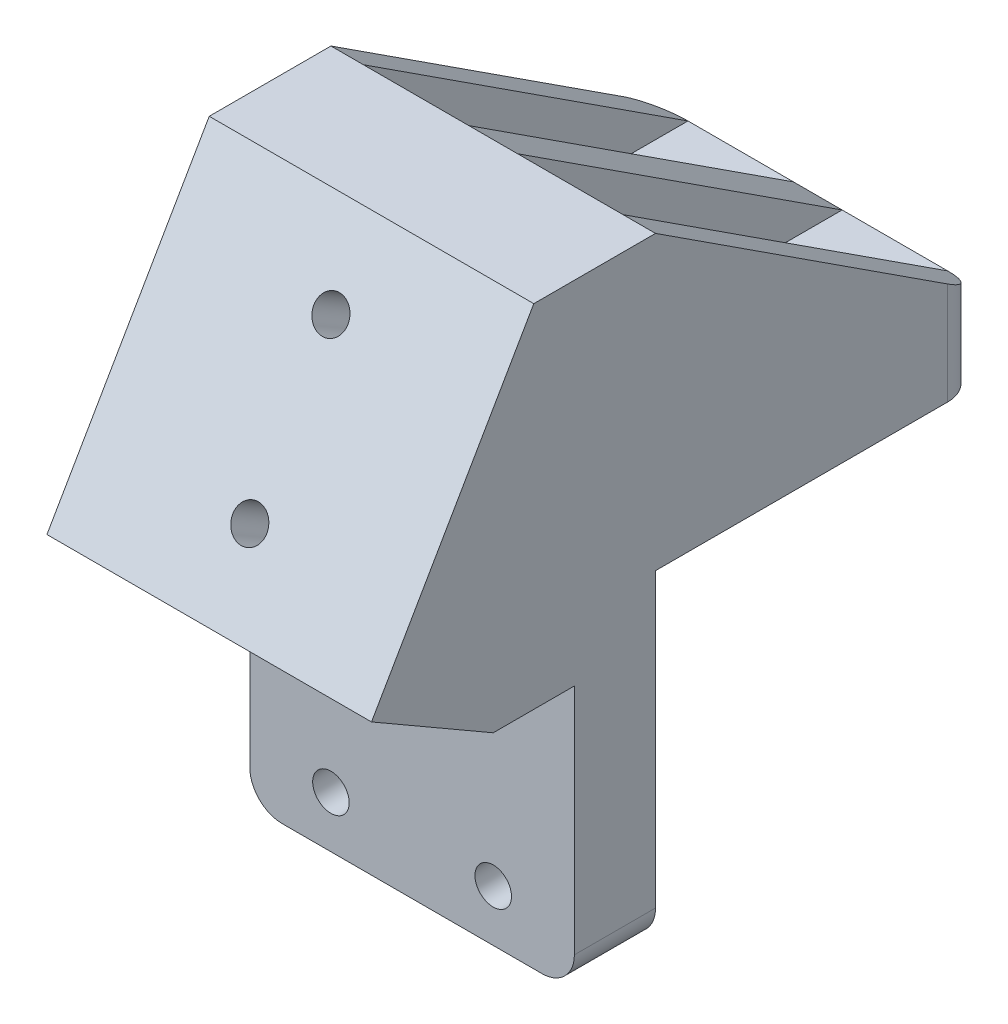
ISO-10303-21;
HEADER;
FILE_DESCRIPTION(('STEP AP214'),'2;1');
FILE_NAME('part.step','',(''),(''),'','','');
FILE_SCHEMA(('AUTOMOTIVE_DESIGN { 1 0 10303 214 1 1 1 1 }'));
ENDSEC;
DATA;
#1=APPLICATION_CONTEXT('core data for automotive mechanical design processes');
#2=APPLICATION_PROTOCOL_DEFINITION('international standard','automotive_design',2000,#1);
#3=PRODUCT_CONTEXT('',#1,'mechanical');
#4=PRODUCT('Part','Part','',(#3));
#5=PRODUCT_RELATED_PRODUCT_CATEGORY('part','',(#4));
#6=PRODUCT_DEFINITION_FORMATION('','',#4);
#7=PRODUCT_DEFINITION_CONTEXT('part definition',#1,'design');
#8=PRODUCT_DEFINITION('design','',#6,#7);
#9=PRODUCT_DEFINITION_SHAPE('','',#8);
#10=(LENGTH_UNIT() NAMED_UNIT(*) SI_UNIT(.MILLI.,.METRE.));
#11=(NAMED_UNIT(*) PLANE_ANGLE_UNIT() SI_UNIT($,.RADIAN.));
#12=(NAMED_UNIT(*) SI_UNIT($,.STERADIAN.) SOLID_ANGLE_UNIT());
#13=UNCERTAINTY_MEASURE_WITH_UNIT(LENGTH_MEASURE(1.E-05),#10,'distance_accuracy_value','');
#14=(GEOMETRIC_REPRESENTATION_CONTEXT(3) GLOBAL_UNCERTAINTY_ASSIGNED_CONTEXT((#13)) GLOBAL_UNIT_ASSIGNED_CONTEXT((#10,
#11,#12)) REPRESENTATION_CONTEXT('',''));
#15=CARTESIAN_POINT('',(0.,0.,0.));
#16=DIRECTION('',(0.,0.,1.));
#17=DIRECTION('',(1.,0.,0.));
#18=AXIS2_PLACEMENT_3D('',#15,#16,#17);
#19=CARTESIAN_POINT('',(40.,10.,-40.));
#20=DIRECTION('',(0.,-1.,0.));
#21=DIRECTION('',(0.,0.,-1.));
#22=AXIS2_PLACEMENT_3D('',#19,#20,#21);
#23=PLANE('',#22);
#24=CARTESIAN_POINT('',(30.,10.,-30.));
#25=DIRECTION('',(0.,-1.,0.));
#26=DIRECTION('',(0.,0.,-1.));
#27=AXIS2_PLACEMENT_3D('',#24,#25,#26);
#28=CIRCLE('',#27,2.25);
#29=CARTESIAN_POINT('',(30.,10.,-32.25));
#30=VERTEX_POINT('',#29);
#31=EDGE_CURVE('E214',#30,#30,#28,.T.);
#32=ORIENTED_EDGE('',*,*,#31,.T.);
#33=EDGE_LOOP('',(#32));
#34=FACE_BOUND('',#33,.T.);
#35=CARTESIAN_POINT('',(30.,10.,-10.));
#36=DIRECTION('',(0.,-1.,0.));
#37=DIRECTION('',(0.,0.,-1.));
#38=AXIS2_PLACEMENT_3D('',#35,#36,#37);
#39=CIRCLE('',#38,2.25);
#40=CARTESIAN_POINT('',(30.,10.,-12.25));
#41=VERTEX_POINT('',#40);
#42=EDGE_CURVE('E218',#41,#41,#39,.T.);
#43=ORIENTED_EDGE('',*,*,#42,.T.);
#44=EDGE_LOOP('',(#43));
#45=FACE_BOUND('',#44,.T.);
#46=DIRECTION('',(0.,0.,-1.));
#47=VECTOR('',#46,1.);
#48=CARTESIAN_POINT('',(23.,10.,0.));
#49=LINE('',#48,#47);
#50=CARTESIAN_POINT('',(23.,10.,0.));
#51=VERTEX_POINT('',#50);
#52=CARTESIAN_POINT('',(23.,10.,-40.));
#53=VERTEX_POINT('',#52);
#54=EDGE_CURVE('E175',#51,#53,#49,.T.);
#55=ORIENTED_EDGE('',*,*,#54,.F.);
#56=DIRECTION('',(-1.,0.,0.));
#57=VECTOR('',#56,1.);
#58=CARTESIAN_POINT('',(40.,10.,0.));
#59=LINE('',#58,#57);
#60=CARTESIAN_POINT('',(36.,10.,0.));
#61=VERTEX_POINT('',#60);
#62=EDGE_CURVE('E202',#61,#51,#59,.T.);
#63=ORIENTED_EDGE('',*,*,#62,.F.);
#64=DIRECTION('',(0.,0.,-1.));
#65=VECTOR('',#64,1.);
#66=CARTESIAN_POINT('',(36.,10.,0.));
#67=LINE('',#66,#65);
#68=CARTESIAN_POINT('',(36.,10.,-40.));
#69=VERTEX_POINT('',#68);
#70=EDGE_CURVE('E197',#61,#69,#67,.T.);
#71=ORIENTED_EDGE('',*,*,#70,.T.);
#72=DIRECTION('',(-1.,0.,0.));
#73=VECTOR('',#72,1.);
#74=CARTESIAN_POINT('',(40.,10.,-40.));
#75=LINE('',#74,#73);
#76=EDGE_CURVE('E189',#69,#53,#75,.T.);
#77=ORIENTED_EDGE('',*,*,#76,.T.);
#78=EDGE_LOOP('',(#55,#63,#71,#77));
#79=FACE_BOUND('',#78,.T.);
#80=ADVANCED_FACE('F33',(#34,#45,#79),#23,.F.);
#81=CARTESIAN_POINT('',(40.,10.,0.));
#82=DIRECTION('',(0.,0.,1.));
#83=DIRECTION('',(1.,0.,0.));
#84=AXIS2_PLACEMENT_3D('',#81,#82,#83);
#85=PLANE('',#84);
#86=DIRECTION('',(0.,-1.,0.));
#87=VECTOR('',#86,1.);
#88=CARTESIAN_POINT('',(23.,36.,0.));
#89=LINE('',#88,#87);
#90=CARTESIAN_POINT('',(23.,36.,0.));
#91=VERTEX_POINT('',#90);
#92=EDGE_CURVE('E174',#91,#51,#89,.T.);
#93=ORIENTED_EDGE('',*,*,#92,.F.);
#94=DIRECTION('',(-1.,0.,0.));
#95=VECTOR('',#94,1.);
#96=CARTESIAN_POINT('',(40.,36.,0.));
#97=LINE('',#96,#95);
#98=CARTESIAN_POINT('',(36.,36.,0.));
#99=VERTEX_POINT('',#98);
#100=EDGE_CURVE('E321',#99,#91,#97,.T.);
#101=ORIENTED_EDGE('',*,*,#100,.F.);
#102=DIRECTION('',(0.,-1.,0.));
#103=VECTOR('',#102,1.);
#104=CARTESIAN_POINT('',(36.,36.,0.));
#105=LINE('',#104,#103);
#106=EDGE_CURVE('E362',#99,#61,#105,.T.);
#107=ORIENTED_EDGE('',*,*,#106,.T.);
#108=ORIENTED_EDGE('',*,*,#62,.T.);
#109=EDGE_LOOP('',(#93,#101,#107,#108));
#110=FACE_BOUND('',#109,.T.);
#111=ADVANCED_FACE('F437',(#110),#85,.F.);
#112=CARTESIAN_POINT('',(40.,-40.,0.));
#113=DIRECTION('',(0.,0.,1.));
#114=DIRECTION('',(1.,0.,0.));
#115=AXIS2_PLACEMENT_3D('',#112,#113,#114);
#116=PLANE('',#115);
#117=CARTESIAN_POINT('',(10.,-13.6506350946109,0.));
#118=DIRECTION('',(0.,0.,1.));
#119=DIRECTION('',(1.,0.,0.));
#120=AXIS2_PLACEMENT_3D('',#117,#118,#119);
#121=CIRCLE('',#120,2.25);
#122=CARTESIAN_POINT('',(12.25,-13.6506350946109,0.));
#123=VERTEX_POINT('',#122);
#124=EDGE_CURVE('E213',#123,#123,#121,.T.);
#125=ORIENTED_EDGE('',*,*,#124,.T.);
#126=EDGE_LOOP('',(#125));
#127=FACE_BOUND('',#126,.T.);
#128=CARTESIAN_POINT('',(30.,-13.6506350946109,0.));
#129=DIRECTION('',(0.,0.,1.));
#130=DIRECTION('',(1.,0.,0.));
#131=AXIS2_PLACEMENT_3D('',#128,#129,#130);
#132=CIRCLE('',#131,2.25);
#133=CARTESIAN_POINT('',(32.25,-13.6506350946109,0.));
#134=VERTEX_POINT('',#133);
#135=EDGE_CURVE('E238',#134,#134,#132,.T.);
#136=ORIENTED_EDGE('',*,*,#135,.T.);
#137=EDGE_LOOP('',(#136));
#138=FACE_BOUND('',#137,.T.);
#139=CARTESIAN_POINT('',(30.,-33.6506350946109,0.));
#140=DIRECTION('',(0.,0.,1.));
#141=DIRECTION('',(1.,0.,0.));
#142=AXIS2_PLACEMENT_3D('',#139,#140,#141);
#143=CIRCLE('',#142,2.25);
#144=CARTESIAN_POINT('',(32.25,-33.6506350946109,0.));
#145=VERTEX_POINT('',#144);
#146=EDGE_CURVE('E234',#145,#145,#143,.T.);
#147=ORIENTED_EDGE('',*,*,#146,.T.);
#148=EDGE_LOOP('',(#147));
#149=FACE_BOUND('',#148,.T.);
#150=CARTESIAN_POINT('',(10.,-33.6506350946109,0.));
#151=DIRECTION('',(0.,0.,1.));
#152=DIRECTION('',(1.,0.,0.));
#153=AXIS2_PLACEMENT_3D('',#150,#151,#152);
#154=CIRCLE('',#153,2.25);
#155=CARTESIAN_POINT('',(12.25,-33.6506350946109,0.));
#156=VERTEX_POINT('',#155);
#157=EDGE_CURVE('E229',#156,#156,#154,.T.);
#158=ORIENTED_EDGE('',*,*,#157,.T.);
#159=EDGE_LOOP('',(#158));
#160=FACE_BOUND('',#159,.T.);
#161=DIRECTION('',(-1.,0.,0.));
#162=VECTOR('',#161,1.);
#163=CARTESIAN_POINT('',(40.,-40.,0.));
#164=LINE('',#163,#162);
#165=CARTESIAN_POINT('',(36.,-40.,0.));
#166=VERTEX_POINT('',#165);
#167=CARTESIAN_POINT('',(4.,-40.,0.));
#168=VERTEX_POINT('',#167);
#169=EDGE_CURVE('E292',#166,#168,#164,.T.);
#170=ORIENTED_EDGE('',*,*,#169,.T.);
#171=CARTESIAN_POINT('',(4.,-36.,0.));
#172=DIRECTION('',(0.,0.,1.));
#173=DIRECTION('',(1.,0.,0.));
#174=AXIS2_PLACEMENT_3D('',#171,#172,#173);
#175=CIRCLE('',#174,4.);
#176=CARTESIAN_POINT('',(0.,-36.,0.));
#177=VERTEX_POINT('',#176);
#178=EDGE_CURVE('E275',#168,#177,#175,.F.);
#179=ORIENTED_EDGE('',*,*,#178,.T.);
#180=DIRECTION('',(0.,1.,0.));
#181=VECTOR('',#180,1.);
#182=CARTESIAN_POINT('',(0.,-40.,0.));
#183=LINE('',#182,#181);
#184=CARTESIAN_POINT('',(0.,0.,0.));
#185=VERTEX_POINT('',#184);
#186=EDGE_CURVE('E387',#177,#185,#183,.T.);
#187=ORIENTED_EDGE('',*,*,#186,.T.);
#188=DIRECTION('',(-1.,0.,0.));
#189=VECTOR('',#188,1.);
#190=CARTESIAN_POINT('',(40.,0.,0.));
#191=LINE('',#190,#189);
#192=CARTESIAN_POINT('',(40.,0.,0.));
#193=VERTEX_POINT('',#192);
#194=EDGE_CURVE('E200',#193,#185,#191,.T.);
#195=ORIENTED_EDGE('',*,*,#194,.F.);
#196=DIRECTION('',(0.,1.,0.));
#197=VECTOR('',#196,1.);
#198=CARTESIAN_POINT('',(40.,-40.,0.));
#199=LINE('',#198,#197);
#200=CARTESIAN_POINT('',(40.,-36.,0.));
#201=VERTEX_POINT('',#200);
#202=EDGE_CURVE('E298',#201,#193,#199,.T.);
#203=ORIENTED_EDGE('',*,*,#202,.F.);
#204=CARTESIAN_POINT('',(36.,-36.,0.));
#205=DIRECTION('',(0.,0.,1.));
#206=DIRECTION('',(1.,0.,0.));
#207=AXIS2_PLACEMENT_3D('',#204,#205,#206);
#208=CIRCLE('',#207,4.);
#209=EDGE_CURVE('E273',#201,#166,#208,.F.);
#210=ORIENTED_EDGE('',*,*,#209,.T.);
#211=EDGE_LOOP('',(#170,#179,#187,#195,#203,#210));
#212=FACE_BOUND('',#211,.T.);
#213=ADVANCED_FACE('F296',(#127,#138,#149,#160,#212),#116,.F.);
#214=CARTESIAN_POINT('',(40.,0.,0.));
#215=DIRECTION('',(0.,1.,0.));
#216=DIRECTION('',(0.,0.,1.));
#217=AXIS2_PLACEMENT_3D('',#214,#215,#216);
#218=PLANE('',#217);
#219=CARTESIAN_POINT('',(10.,0.,-10.));
#220=DIRECTION('',(0.,1.,0.));
#221=DIRECTION('',(0.,0.,1.));
#222=AXIS2_PLACEMENT_3D('',#219,#220,#221);
#223=CIRCLE('',#222,2.25);
#224=CARTESIAN_POINT('',(10.,0.,-7.75));
#225=VERTEX_POINT('',#224);
#226=EDGE_CURVE('E225',#225,#225,#223,.T.);
#227=ORIENTED_EDGE('',*,*,#226,.T.);
#228=EDGE_LOOP('',(#227));
#229=FACE_BOUND('',#228,.T.);
#230=CARTESIAN_POINT('',(30.,0.,-10.));
#231=DIRECTION('',(0.,1.,0.));
#232=DIRECTION('',(0.,0.,1.));
#233=AXIS2_PLACEMENT_3D('',#230,#231,#232);
#234=CIRCLE('',#233,2.25);
#235=CARTESIAN_POINT('',(30.,0.,-7.75));
#236=VERTEX_POINT('',#235);
#237=EDGE_CURVE('E221',#236,#236,#234,.T.);
#238=ORIENTED_EDGE('',*,*,#237,.T.);
#239=EDGE_LOOP('',(#238));
#240=FACE_BOUND('',#239,.T.);
#241=CARTESIAN_POINT('',(30.,0.,-30.));
#242=DIRECTION('',(0.,1.,0.));
#243=DIRECTION('',(0.,0.,1.));
#244=AXIS2_PLACEMENT_3D('',#241,#242,#243);
#245=CIRCLE('',#244,2.25);
#246=CARTESIAN_POINT('',(30.,0.,-27.75));
#247=VERTEX_POINT('',#246);
#248=EDGE_CURVE('E217',#247,#247,#245,.T.);
#249=ORIENTED_EDGE('',*,*,#248,.T.);
#250=EDGE_LOOP('',(#249));
#251=FACE_BOUND('',#250,.T.);
#252=CARTESIAN_POINT('',(10.,0.,-30.));
#253=DIRECTION('',(0.,1.,0.));
#254=DIRECTION('',(0.,0.,1.));
#255=AXIS2_PLACEMENT_3D('',#252,#253,#254);
#256=CIRCLE('',#255,2.25);
#257=CARTESIAN_POINT('',(10.,0.,-27.75));
#258=VERTEX_POINT('',#257);
#259=EDGE_CURVE('E212',#258,#258,#256,.T.);
#260=ORIENTED_EDGE('',*,*,#259,.T.);
#261=EDGE_LOOP('',(#260));
#262=FACE_BOUND('',#261,.T.);
#263=DIRECTION('',(0.,0.,-1.));
#264=VECTOR('',#263,1.);
#265=CARTESIAN_POINT('',(0.,0.,0.));
#266=LINE('',#265,#264);
#267=CARTESIAN_POINT('',(0.,0.,-36.));
#268=VERTEX_POINT('',#267);
#269=EDGE_CURVE('E399',#185,#268,#266,.T.);
#270=ORIENTED_EDGE('',*,*,#269,.T.);
#271=CARTESIAN_POINT('',(4.,0.,-36.));
#272=DIRECTION('',(0.,1.,0.));
#273=DIRECTION('',(0.,0.,1.));
#274=AXIS2_PLACEMENT_3D('',#271,#272,#273);
#275=CIRCLE('',#274,4.);
#276=CARTESIAN_POINT('',(4.,0.,-40.));
#277=VERTEX_POINT('',#276);
#278=EDGE_CURVE('E259',#268,#277,#275,.F.);
#279=ORIENTED_EDGE('',*,*,#278,.T.);
#280=DIRECTION('',(-1.,0.,0.));
#281=VECTOR('',#280,1.);
#282=CARTESIAN_POINT('',(40.,0.,-40.));
#283=LINE('',#282,#281);
#284=CARTESIAN_POINT('',(36.,0.,-40.));
#285=VERTEX_POINT('',#284);
#286=EDGE_CURVE('E198',#285,#277,#283,.T.);
#287=ORIENTED_EDGE('',*,*,#286,.F.);
#288=CARTESIAN_POINT('',(36.,0.,-36.));
#289=DIRECTION('',(0.,1.,0.));
#290=DIRECTION('',(0.,0.,1.));
#291=AXIS2_PLACEMENT_3D('',#288,#289,#290);
#292=CIRCLE('',#291,4.);
#293=CARTESIAN_POINT('',(40.,0.,-36.));
#294=VERTEX_POINT('',#293);
#295=EDGE_CURVE('E257',#285,#294,#292,.F.);
#296=ORIENTED_EDGE('',*,*,#295,.T.);
#297=DIRECTION('',(0.,0.,-1.));
#298=VECTOR('',#297,1.);
#299=CARTESIAN_POINT('',(40.,0.,0.));
#300=LINE('',#299,#298);
#301=EDGE_CURVE('E389',#193,#294,#300,.T.);
#302=ORIENTED_EDGE('',*,*,#301,.F.);
#303=ORIENTED_EDGE('',*,*,#194,.T.);
#304=EDGE_LOOP('',(#270,#279,#287,#296,#302,#303));
#305=FACE_BOUND('',#304,.T.);
#306=ADVANCED_FACE('F422',(#229,#240,#251,#262,#305),#218,.F.);
#307=CARTESIAN_POINT('',(40.,0.,-40.));
#308=DIRECTION('',(0.,0.,1.));
#309=DIRECTION('',(1.,0.,0.));
#310=AXIS2_PLACEMENT_3D('',#307,#308,#309);
#311=PLANE('',#310);
#312=ORIENTED_EDGE('',*,*,#286,.T.);
#313=DIRECTION('',(0.,1.,0.));
#314=VECTOR('',#313,1.);
#315=CARTESIAN_POINT('',(4.,10.,-40.));
#316=LINE('',#315,#314);
#317=CARTESIAN_POINT('',(4.,10.,-40.));
#318=VERTEX_POINT('',#317);
#319=EDGE_CURVE('E249',#277,#318,#316,.T.);
#320=ORIENTED_EDGE('',*,*,#319,.T.);
#321=CARTESIAN_POINT('',(17.,10.,-40.));
#322=VERTEX_POINT('',#321);
#323=EDGE_CURVE('E193',#322,#318,#75,.T.);
#324=ORIENTED_EDGE('',*,*,#323,.F.);
#325=DIRECTION('',(1.,0.,0.));
#326=VECTOR('',#325,1.);
#327=CARTESIAN_POINT('',(17.,10.,-40.));
#328=LINE('',#327,#326);
#329=EDGE_CURVE('E168',#322,#53,#328,.T.);
#330=ORIENTED_EDGE('',*,*,#329,.T.);
#331=ORIENTED_EDGE('',*,*,#76,.F.);
#332=DIRECTION('',(0.,1.,0.));
#333=VECTOR('',#332,1.);
#334=CARTESIAN_POINT('',(36.,0.,-40.));
#335=LINE('',#334,#333);
#336=EDGE_CURVE('E208',#69,#285,#335,.F.);
#337=ORIENTED_EDGE('',*,*,#336,.T.);
#338=EDGE_LOOP('',(#312,#320,#324,#330,#331,#337));
#339=FACE_BOUND('',#338,.T.);
#340=ADVANCED_FACE('F188',(#339),#311,.F.);
#341=CARTESIAN_POINT('',(10.,10.,-10.));
#342=DIRECTION('',(0.,-1.,0.));
#343=DIRECTION('',(0.,0.,-1.));
#344=AXIS2_PLACEMENT_3D('',#341,#342,#343);
#345=CIRCLE('',#344,2.25);
#346=CARTESIAN_POINT('',(10.,10.,-12.25));
#347=VERTEX_POINT('',#346);
#348=EDGE_CURVE('E222',#347,#347,#345,.T.);
#349=ORIENTED_EDGE('',*,*,#348,.T.);
#350=EDGE_LOOP('',(#349));
#351=FACE_BOUND('',#350,.T.);
#352=CARTESIAN_POINT('',(10.,10.,-30.));
#353=DIRECTION('',(0.,-1.,0.));
#354=DIRECTION('',(0.,0.,-1.));
#355=AXIS2_PLACEMENT_3D('',#352,#353,#354);
#356=CIRCLE('',#355,2.25);
#357=CARTESIAN_POINT('',(10.,10.,-32.25));
#358=VERTEX_POINT('',#357);
#359=EDGE_CURVE('E209',#358,#358,#356,.T.);
#360=ORIENTED_EDGE('',*,*,#359,.T.);
#361=EDGE_LOOP('',(#360));
#362=FACE_BOUND('',#361,.T.);
#363=CARTESIAN_POINT('',(17.,10.,0.));
#364=VERTEX_POINT('',#363);
#365=CARTESIAN_POINT('',(4.,10.,0.));
#366=VERTEX_POINT('',#365);
#367=EDGE_CURVE('E320',#364,#366,#59,.T.);
#368=ORIENTED_EDGE('',*,*,#367,.F.);
#369=DIRECTION('',(0.,0.,-1.));
#370=VECTOR('',#369,1.);
#371=CARTESIAN_POINT('',(17.,10.,0.));
#372=LINE('',#371,#370);
#373=EDGE_CURVE('E438',#364,#322,#372,.T.);
#374=ORIENTED_EDGE('',*,*,#373,.T.);
#375=ORIENTED_EDGE('',*,*,#323,.T.);
#376=DIRECTION('',(0.,0.,1.));
#377=VECTOR('',#376,1.);
#378=CARTESIAN_POINT('',(4.,10.,0.));
#379=LINE('',#378,#377);
#380=EDGE_CURVE('E342',#318,#366,#379,.T.);
#381=ORIENTED_EDGE('',*,*,#380,.T.);
#382=EDGE_LOOP('',(#368,#374,#375,#381));
#383=FACE_BOUND('',#382,.T.);
#384=ADVANCED_FACE('F447',(#351,#362,#383),#23,.F.);
#385=CARTESIAN_POINT('',(17.,36.,0.));
#386=VERTEX_POINT('',#385);
#387=CARTESIAN_POINT('',(4.,36.,0.));
#388=VERTEX_POINT('',#387);
#389=EDGE_CURVE('E317',#386,#388,#97,.T.);
#390=ORIENTED_EDGE('',*,*,#389,.F.);
#391=DIRECTION('',(0.,-1.,0.));
#392=VECTOR('',#391,1.);
#393=CARTESIAN_POINT('',(17.,36.,0.));
#394=LINE('',#393,#392);
#395=EDGE_CURVE('E194',#386,#364,#394,.T.);
#396=ORIENTED_EDGE('',*,*,#395,.T.);
#397=ORIENTED_EDGE('',*,*,#367,.T.);
#398=DIRECTION('',(0.,1.,0.));
#399=VECTOR('',#398,1.);
#400=CARTESIAN_POINT('',(4.,0.,0.));
#401=LINE('',#400,#399);
#402=EDGE_CURVE('E335',#366,#388,#401,.T.);
#403=ORIENTED_EDGE('',*,*,#402,.T.);
#404=EDGE_LOOP('',(#390,#396,#397,#403));
#405=FACE_BOUND('',#404,.T.);
#406=ADVANCED_FACE('F336',(#405),#85,.F.);
#407=CARTESIAN_POINT('',(40.,36.,0.));
#408=DIRECTION('',(0.,-1.,0.));
#409=DIRECTION('',(0.,0.,-1.));
#410=AXIS2_PLACEMENT_3D('',#407,#408,#409);
#411=PLANE('',#410);
#412=DIRECTION('',(0.,0.,1.));
#413=VECTOR('',#412,1.);
#414=CARTESIAN_POINT('',(0.,36.,0.));
#415=LINE('',#414,#413);
#416=CARTESIAN_POINT('',(0.,36.,0.));
#417=VERTEX_POINT('',#416);
#418=CARTESIAN_POINT('',(0.,36.,15.));
#419=VERTEX_POINT('',#418);
#420=EDGE_CURVE('E402',#417,#419,#415,.T.);
#421=ORIENTED_EDGE('',*,*,#420,.T.);
#422=DIRECTION('',(-1.,0.,0.));
#423=VECTOR('',#422,1.);
#424=CARTESIAN_POINT('',(40.,36.,15.));
#425=LINE('',#424,#423);
#426=CARTESIAN_POINT('',(40.,36.,15.));
#427=VERTEX_POINT('',#426);
#428=EDGE_CURVE('E315',#427,#419,#425,.T.);
#429=ORIENTED_EDGE('',*,*,#428,.F.);
#430=DIRECTION('',(0.,0.,1.));
#431=VECTOR('',#430,1.);
#432=CARTESIAN_POINT('',(40.,36.,0.));
#433=LINE('',#432,#431);
#434=CARTESIAN_POINT('',(40.,36.,0.));
#435=VERTEX_POINT('',#434);
#436=EDGE_CURVE('E391',#435,#427,#433,.T.);
#437=ORIENTED_EDGE('',*,*,#436,.F.);
#438=EDGE_CURVE('E318',#435,#99,#97,.T.);
#439=ORIENTED_EDGE('',*,*,#438,.T.);
#440=ORIENTED_EDGE('',*,*,#100,.T.);
#441=DIRECTION('',(1.,0.,0.));
#442=VECTOR('',#441,1.);
#443=CARTESIAN_POINT('',(17.,36.,0.));
#444=LINE('',#443,#442);
#445=EDGE_CURVE('E171',#386,#91,#444,.T.);
#446=ORIENTED_EDGE('',*,*,#445,.F.);
#447=ORIENTED_EDGE('',*,*,#389,.T.);
#448=DIRECTION('',(-1.,0.,0.));
#449=VECTOR('',#448,1.);
#450=CARTESIAN_POINT('',(4.,36.,0.));
#451=LINE('',#450,#449);
#452=EDGE_CURVE('E330',#388,#417,#451,.T.);
#453=ORIENTED_EDGE('',*,*,#452,.T.);
#454=EDGE_LOOP('',(#421,#429,#437,#439,#440,#446,#447,#453));
#455=FACE_BOUND('',#454,.T.);
#456=ADVANCED_FACE('F328',(#455),#411,.F.);
#457=CARTESIAN_POINT('',(40.,36.,15.));
#458=DIRECTION('',(0.,-0.499999999999995,-0.866025403784442));
#459=DIRECTION('',(0.,0.866025403784442,-0.499999999999995));
#460=AXIS2_PLACEMENT_3D('',#457,#458,#459);
#461=PLANE('',#460);
#462=CARTESIAN_POINT('',(20.,10.0192378864667,29.9999999999998));
#463=DIRECTION('',(0.,-0.499999999999995,-0.866025403784442));
#464=DIRECTION('',(0.,0.866025403784442,-0.499999999999995));
#465=AXIS2_PLACEMENT_3D('',#462,#463,#464);
#466=CIRCLE('',#465,2.1);
#467=CARTESIAN_POINT('',(20.,11.8378912344141,28.9499999999999));
#468=VERTEX_POINT('',#467);
#469=EDGE_CURVE('E230',#468,#468,#466,.F.);
#470=ORIENTED_EDGE('',*,*,#469,.F.);
#471=EDGE_LOOP('',(#470));
#472=FACE_BOUND('',#471,.T.);
#473=CARTESIAN_POINT('',(20.,27.3397459621556,19.9999999999999));
#474=DIRECTION('',(0.,-0.499999999999995,-0.866025403784442));
#475=DIRECTION('',(0.,0.866025403784442,-0.499999999999995));
#476=AXIS2_PLACEMENT_3D('',#473,#474,#475);
#477=CIRCLE('',#476,2.1);
#478=CARTESIAN_POINT('',(20.,29.1583993101029,18.95));
#479=VERTEX_POINT('',#478);
#480=EDGE_CURVE('E242',#479,#479,#477,.F.);
#481=ORIENTED_EDGE('',*,*,#480,.F.);
#482=EDGE_LOOP('',(#481));
#483=FACE_BOUND('',#482,.T.);
#484=DIRECTION('',(0.,-0.866025403784442,0.499999999999995));
#485=VECTOR('',#484,1.);
#486=CARTESIAN_POINT('',(0.,36.,15.));
#487=LINE('',#486,#485);
#488=CARTESIAN_POINT('',(0.,1.35898384862231,34.9999999999998));
#489=VERTEX_POINT('',#488);
#490=EDGE_CURVE('E404',#419,#489,#487,.T.);
#491=ORIENTED_EDGE('',*,*,#490,.T.);
#492=DIRECTION('',(-1.,0.,0.));
#493=VECTOR('',#492,1.);
#494=CARTESIAN_POINT('',(40.,1.35898384862231,34.9999999999998));
#495=LINE('',#494,#493);
#496=CARTESIAN_POINT('',(40.,1.35898384862231,34.9999999999998));
#497=VERTEX_POINT('',#496);
#498=EDGE_CURVE('E312',#497,#489,#495,.T.);
#499=ORIENTED_EDGE('',*,*,#498,.F.);
#500=DIRECTION('',(0.,-0.866025403784442,0.499999999999995));
#501=VECTOR('',#500,1.);
#502=CARTESIAN_POINT('',(40.,36.,15.));
#503=LINE('',#502,#501);
#504=EDGE_CURVE('E393',#427,#497,#503,.T.);
#505=ORIENTED_EDGE('',*,*,#504,.F.);
#506=ORIENTED_EDGE('',*,*,#428,.T.);
#507=EDGE_LOOP('',(#491,#499,#505,#506));
#508=FACE_BOUND('',#507,.T.);
#509=ADVANCED_FACE('F592',(#472,#483,#508),#461,.F.);
#510=CARTESIAN_POINT('',(40.,1.35898384862231,34.9999999999998));
#511=DIRECTION('',(0.,0.866025403784444,-0.499999999999992));
#512=DIRECTION('',(0.,0.499999999999992,0.866025403784444));
#513=AXIS2_PLACEMENT_3D('',#510,#511,#512);
#514=PLANE('',#513);
#515=DIRECTION('',(0.,-0.499999999999992,-0.866025403784444));
#516=VECTOR('',#515,1.);
#517=CARTESIAN_POINT('',(0.,1.35898384862231,34.9999999999998));
#518=LINE('',#517,#516);
#519=CARTESIAN_POINT('',(0.,-7.30127018922176,20.));
#520=VERTEX_POINT('',#519);
#521=EDGE_CURVE('E406',#489,#520,#518,.T.);
#522=ORIENTED_EDGE('',*,*,#521,.T.);
#523=DIRECTION('',(-1.,0.,0.));
#524=VECTOR('',#523,1.);
#525=CARTESIAN_POINT('',(40.,-7.30127018922176,20.));
#526=LINE('',#525,#524);
#527=CARTESIAN_POINT('',(40.,-7.30127018922176,20.));
#528=VERTEX_POINT('',#527);
#529=EDGE_CURVE('E309',#528,#520,#526,.T.);
#530=ORIENTED_EDGE('',*,*,#529,.F.);
#531=DIRECTION('',(0.,-0.499999999999992,-0.866025403784444));
#532=VECTOR('',#531,1.);
#533=CARTESIAN_POINT('',(40.,1.35898384862231,34.9999999999998));
#534=LINE('',#533,#532);
#535=EDGE_CURVE('E395',#497,#528,#534,.T.);
#536=ORIENTED_EDGE('',*,*,#535,.F.);
#537=ORIENTED_EDGE('',*,*,#498,.T.);
#538=EDGE_LOOP('',(#522,#530,#536,#537));
#539=FACE_BOUND('',#538,.T.);
#540=ADVANCED_FACE('F585',(#539),#514,.F.);
#541=CARTESIAN_POINT('',(40.,-7.30127018922176,20.));
#542=DIRECTION('',(0.,1.,0.));
#543=DIRECTION('',(0.,0.,1.));
#544=AXIS2_PLACEMENT_3D('',#541,#542,#543);
#545=PLANE('',#544);
#546=DIRECTION('',(0.,0.,-1.));
#547=VECTOR('',#546,1.);
#548=CARTESIAN_POINT('',(0.,-7.30127018922176,20.));
#549=LINE('',#548,#547);
#550=CARTESIAN_POINT('',(0.,-7.30127018922176,10.));
#551=VERTEX_POINT('',#550);
#552=EDGE_CURVE('E407',#520,#551,#549,.T.);
#553=ORIENTED_EDGE('',*,*,#552,.T.);
#554=DIRECTION('',(-1.,0.,0.));
#555=VECTOR('',#554,1.);
#556=CARTESIAN_POINT('',(40.,-7.30127018922176,10.));
#557=LINE('',#556,#555);
#558=CARTESIAN_POINT('',(40.,-7.30127018922176,10.));
#559=VERTEX_POINT('',#558);
#560=EDGE_CURVE('E302',#559,#551,#557,.T.);
#561=ORIENTED_EDGE('',*,*,#560,.F.);
#562=DIRECTION('',(0.,0.,-1.));
#563=VECTOR('',#562,1.);
#564=CARTESIAN_POINT('',(40.,-7.30127018922176,20.));
#565=LINE('',#564,#563);
#566=EDGE_CURVE('E290',#528,#559,#565,.T.);
#567=ORIENTED_EDGE('',*,*,#566,.F.);
#568=ORIENTED_EDGE('',*,*,#529,.T.);
#569=EDGE_LOOP('',(#553,#561,#567,#568));
#570=FACE_BOUND('',#569,.T.);
#571=ADVANCED_FACE('F573',(#570),#545,.F.);
#572=CARTESIAN_POINT('',(40.,-7.30127018922176,10.));
#573=DIRECTION('',(0.,0.,-1.));
#574=DIRECTION('',(0.,1.,0.));
#575=AXIS2_PLACEMENT_3D('',#572,#573,#574);
#576=PLANE('',#575);
#577=CARTESIAN_POINT('',(10.,-13.6506350946109,10.));
#578=DIRECTION('',(0.,0.,-1.));
#579=DIRECTION('',(0.,1.,0.));
#580=AXIS2_PLACEMENT_3D('',#577,#578,#579);
#581=CIRCLE('',#580,2.25);
#582=CARTESIAN_POINT('',(10.,-11.4006350946109,10.));
#583=VERTEX_POINT('',#582);
#584=EDGE_CURVE('E239',#583,#583,#581,.T.);
#585=ORIENTED_EDGE('',*,*,#584,.T.);
#586=EDGE_LOOP('',(#585));
#587=FACE_BOUND('',#586,.T.);
#588=CARTESIAN_POINT('',(30.,-13.6506350946109,10.));
#589=DIRECTION('',(0.,0.,-1.));
#590=DIRECTION('',(0.,1.,0.));
#591=AXIS2_PLACEMENT_3D('',#588,#589,#590);
#592=CIRCLE('',#591,2.25);
#593=CARTESIAN_POINT('',(30.,-11.4006350946109,10.));
#594=VERTEX_POINT('',#593);
#595=EDGE_CURVE('E235',#594,#594,#592,.T.);
#596=ORIENTED_EDGE('',*,*,#595,.T.);
#597=EDGE_LOOP('',(#596));
#598=FACE_BOUND('',#597,.T.);
#599=CARTESIAN_POINT('',(30.,-33.6506350946109,10.));
#600=DIRECTION('',(0.,0.,-1.));
#601=DIRECTION('',(0.,1.,0.));
#602=AXIS2_PLACEMENT_3D('',#599,#600,#601);
#603=CIRCLE('',#602,2.25);
#604=CARTESIAN_POINT('',(30.,-31.4006350946109,10.));
#605=VERTEX_POINT('',#604);
#606=EDGE_CURVE('E231',#605,#605,#603,.T.);
#607=ORIENTED_EDGE('',*,*,#606,.T.);
#608=EDGE_LOOP('',(#607));
#609=FACE_BOUND('',#608,.T.);
#610=CARTESIAN_POINT('',(10.,-33.6506350946109,10.));
#611=DIRECTION('',(0.,0.,-1.));
#612=DIRECTION('',(0.,1.,0.));
#613=AXIS2_PLACEMENT_3D('',#610,#611,#612);
#614=CIRCLE('',#613,2.25);
#615=CARTESIAN_POINT('',(10.,-31.4006350946109,10.));
#616=VERTEX_POINT('',#615);
#617=EDGE_CURVE('E226',#616,#616,#614,.T.);
#618=ORIENTED_EDGE('',*,*,#617,.T.);
#619=EDGE_LOOP('',(#618));
#620=FACE_BOUND('',#619,.T.);
#621=DIRECTION('',(0.,-1.,0.));
#622=VECTOR('',#621,1.);
#623=CARTESIAN_POINT('',(0.,-7.30127018922176,10.));
#624=LINE('',#623,#622);
#625=CARTESIAN_POINT('',(0.,-36.,10.));
#626=VERTEX_POINT('',#625);
#627=EDGE_CURVE('E305',#551,#626,#624,.T.);
#628=ORIENTED_EDGE('',*,*,#627,.T.);
#629=CARTESIAN_POINT('',(4.,-36.,10.));
#630=DIRECTION('',(0.,0.,-1.));
#631=DIRECTION('',(0.,1.,0.));
#632=AXIS2_PLACEMENT_3D('',#629,#630,#631);
#633=CIRCLE('',#632,4.);
#634=CARTESIAN_POINT('',(4.,-40.,10.));
#635=VERTEX_POINT('',#634);
#636=EDGE_CURVE('E11',#626,#635,#633,.F.);
#637=ORIENTED_EDGE('',*,*,#636,.T.);
#638=DIRECTION('',(-1.,0.,0.));
#639=VECTOR('',#638,1.);
#640=CARTESIAN_POINT('',(40.,-40.,10.));
#641=LINE('',#640,#639);
#642=CARTESIAN_POINT('',(36.,-40.,10.));
#643=VERTEX_POINT('',#642);
#644=EDGE_CURVE('E282',#643,#635,#641,.T.);
#645=ORIENTED_EDGE('',*,*,#644,.F.);
#646=CARTESIAN_POINT('',(36.,-36.,10.));
#647=DIRECTION('',(0.,0.,-1.));
#648=DIRECTION('',(0.,1.,0.));
#649=AXIS2_PLACEMENT_3D('',#646,#647,#648);
#650=CIRCLE('',#649,4.);
#651=CARTESIAN_POINT('',(40.,-36.,10.));
#652=VERTEX_POINT('',#651);
#653=EDGE_CURVE('E41',#643,#652,#650,.F.);
#654=ORIENTED_EDGE('',*,*,#653,.T.);
#655=DIRECTION('',(0.,-1.,0.));
#656=VECTOR('',#655,1.);
#657=CARTESIAN_POINT('',(40.,-7.30127018922176,10.));
#658=LINE('',#657,#656);
#659=EDGE_CURVE('E281',#559,#652,#658,.T.);
#660=ORIENTED_EDGE('',*,*,#659,.F.);
#661=ORIENTED_EDGE('',*,*,#560,.T.);
#662=EDGE_LOOP('',(#628,#637,#645,#654,#660,#661));
#663=FACE_BOUND('',#662,.T.);
#664=ADVANCED_FACE('F279',(#587,#598,#609,#620,#663),#576,.F.);
#665=CARTESIAN_POINT('',(40.,-40.,10.));
#666=DIRECTION('',(0.,1.,0.));
#667=DIRECTION('',(0.,0.,1.));
#668=AXIS2_PLACEMENT_3D('',#665,#666,#667);
#669=PLANE('',#668);
#670=ORIENTED_EDGE('',*,*,#644,.T.);
#671=DIRECTION('',(0.,0.,-1.));
#672=VECTOR('',#671,1.);
#673=CARTESIAN_POINT('',(4.,-40.,0.));
#674=LINE('',#673,#672);
#675=EDGE_CURVE('E270',#635,#168,#674,.T.);
#676=ORIENTED_EDGE('',*,*,#675,.T.);
#677=ORIENTED_EDGE('',*,*,#169,.F.);
#678=DIRECTION('',(0.,0.,-1.));
#679=VECTOR('',#678,1.);
#680=CARTESIAN_POINT('',(36.,-40.,10.));
#681=LINE('',#680,#679);
#682=EDGE_CURVE('E53',#166,#643,#681,.F.);
#683=ORIENTED_EDGE('',*,*,#682,.T.);
#684=EDGE_LOOP('',(#670,#676,#677,#683));
#685=FACE_BOUND('',#684,.T.);
#686=ADVANCED_FACE('F299',(#685),#669,.F.);
#687=CARTESIAN_POINT('',(40.,0.,0.));
#688=DIRECTION('',(-1.,0.,0.));
#689=DIRECTION('',(0.,0.,1.));
#690=AXIS2_PLACEMENT_3D('',#687,#688,#689);
#691=PLANE('',#690);
#692=ORIENTED_EDGE('',*,*,#301,.T.);
#693=DIRECTION('',(0.,1.,0.));
#694=VECTOR('',#693,1.);
#695=CARTESIAN_POINT('',(40.,0.,-36.));
#696=LINE('',#695,#694);
#697=CARTESIAN_POINT('',(40.,12.6,-36.));
#698=VERTEX_POINT('',#697);
#699=EDGE_CURVE('E264',#294,#698,#696,.T.);
#700=ORIENTED_EDGE('',*,*,#699,.T.);
#701=DIRECTION('',(0.,0.544988350595414,0.838443616300637));
#702=VECTOR('',#701,1.);
#703=CARTESIAN_POINT('',(40.,10.,-40.));
#704=LINE('',#703,#702);
#705=EDGE_CURVE('E351',#698,#435,#704,.T.);
#706=ORIENTED_EDGE('',*,*,#705,.T.);
#707=ORIENTED_EDGE('',*,*,#436,.T.);
#708=ORIENTED_EDGE('',*,*,#504,.T.);
#709=ORIENTED_EDGE('',*,*,#535,.T.);
#710=ORIENTED_EDGE('',*,*,#566,.T.);
#711=ORIENTED_EDGE('',*,*,#659,.T.);
#712=DIRECTION('',(0.,0.,-1.));
#713=VECTOR('',#712,1.);
#714=CARTESIAN_POINT('',(40.,-36.,0.));
#715=LINE('',#714,#713);
#716=EDGE_CURVE('E261',#652,#201,#715,.T.);
#717=ORIENTED_EDGE('',*,*,#716,.T.);
#718=ORIENTED_EDGE('',*,*,#202,.T.);
#719=EDGE_LOOP('',(#692,#700,#706,#707,#708,#709,#710,#711,#717,#718));
#720=FACE_BOUND('',#719,.T.);
#721=ADVANCED_FACE('F287',(#720),#691,.F.);
#722=CARTESIAN_POINT('',(0.,0.,0.));
#723=DIRECTION('',(-1.,0.,0.));
#724=DIRECTION('',(0.,0.,1.));
#725=AXIS2_PLACEMENT_3D('',#722,#723,#724);
#726=PLANE('',#725);
#727=DIRECTION('',(0.,-0.544988350595414,-0.838443616300637));
#728=VECTOR('',#727,1.);
#729=CARTESIAN_POINT('',(0.,25.3075571177504,-16.4499121265378));
#730=LINE('',#729,#728);
#731=CARTESIAN_POINT('',(0.,12.6,-36.));
#732=VERTEX_POINT('',#731);
#733=EDGE_CURVE('E350',#417,#732,#730,.T.);
#734=ORIENTED_EDGE('',*,*,#733,.T.);
#735=DIRECTION('',(0.,1.,0.));
#736=VECTOR('',#735,1.);
#737=CARTESIAN_POINT('',(0.,0.,-36.));
#738=LINE('',#737,#736);
#739=EDGE_CURVE('E255',#732,#268,#738,.F.);
#740=ORIENTED_EDGE('',*,*,#739,.T.);
#741=ORIENTED_EDGE('',*,*,#269,.F.);
#742=ORIENTED_EDGE('',*,*,#186,.F.);
#743=DIRECTION('',(0.,0.,-1.));
#744=VECTOR('',#743,1.);
#745=CARTESIAN_POINT('',(0.,-36.,10.));
#746=LINE('',#745,#744);
#747=EDGE_CURVE('E253',#177,#626,#746,.F.);
#748=ORIENTED_EDGE('',*,*,#747,.T.);
#749=ORIENTED_EDGE('',*,*,#627,.F.);
#750=ORIENTED_EDGE('',*,*,#552,.F.);
#751=ORIENTED_EDGE('',*,*,#521,.F.);
#752=ORIENTED_EDGE('',*,*,#490,.F.);
#753=ORIENTED_EDGE('',*,*,#420,.F.);
#754=EDGE_LOOP('',(#734,#740,#741,#742,#748,#749,#750,#751,#752,#753));
#755=FACE_BOUND('',#754,.T.);
#756=ADVANCED_FACE('F417',(#755),#726,.T.);
#757=CARTESIAN_POINT('',(10.,-40.,-30.));
#758=DIRECTION('',(0.,1.,0.));
#759=DIRECTION('',(0.,0.,1.));
#760=AXIS2_PLACEMENT_3D('',#757,#758,#759);
#761=CYLINDRICAL_SURFACE('',#760,2.25);
#762=ORIENTED_EDGE('',*,*,#359,.F.);
#763=EDGE_LOOP('',(#762));
#764=FACE_BOUND('',#763,.T.);
#765=ORIENTED_EDGE('',*,*,#259,.F.);
#766=EDGE_LOOP('',(#765));
#767=FACE_BOUND('',#766,.T.);
#768=ADVANCED_FACE('F480',(#764,#767),#761,.F.);
#769=CARTESIAN_POINT('',(30.,-40.,-30.));
#770=DIRECTION('',(0.,1.,0.));
#771=DIRECTION('',(0.,0.,1.));
#772=AXIS2_PLACEMENT_3D('',#769,#770,#771);
#773=CYLINDRICAL_SURFACE('',#772,2.25);
#774=ORIENTED_EDGE('',*,*,#31,.F.);
#775=EDGE_LOOP('',(#774));
#776=FACE_BOUND('',#775,.T.);
#777=ORIENTED_EDGE('',*,*,#248,.F.);
#778=EDGE_LOOP('',(#777));
#779=FACE_BOUND('',#778,.T.);
#780=ADVANCED_FACE('F483',(#776,#779),#773,.F.);
#781=CARTESIAN_POINT('',(30.,-40.,-10.));
#782=DIRECTION('',(0.,1.,0.));
#783=DIRECTION('',(0.,0.,1.));
#784=AXIS2_PLACEMENT_3D('',#781,#782,#783);
#785=CYLINDRICAL_SURFACE('',#784,2.25);
#786=ORIENTED_EDGE('',*,*,#42,.F.);
#787=EDGE_LOOP('',(#786));
#788=FACE_BOUND('',#787,.T.);
#789=ORIENTED_EDGE('',*,*,#237,.F.);
#790=EDGE_LOOP('',(#789));
#791=FACE_BOUND('',#790,.T.);
#792=ADVANCED_FACE('F753',(#788,#791),#785,.F.);
#793=CARTESIAN_POINT('',(10.,-40.,-10.));
#794=DIRECTION('',(0.,1.,0.));
#795=DIRECTION('',(0.,0.,1.));
#796=AXIS2_PLACEMENT_3D('',#793,#794,#795);
#797=CYLINDRICAL_SURFACE('',#796,2.25);
#798=ORIENTED_EDGE('',*,*,#348,.F.);
#799=EDGE_LOOP('',(#798));
#800=FACE_BOUND('',#799,.T.);
#801=ORIENTED_EDGE('',*,*,#226,.F.);
#802=EDGE_LOOP('',(#801));
#803=FACE_BOUND('',#802,.T.);
#804=ADVANCED_FACE('F744',(#800,#803),#797,.F.);
#805=CARTESIAN_POINT('',(10.,-33.6506350946109,-40.));
#806=DIRECTION('',(0.,0.,1.));
#807=DIRECTION('',(1.,0.,0.));
#808=AXIS2_PLACEMENT_3D('',#805,#806,#807);
#809=CYLINDRICAL_SURFACE('',#808,2.25);
#810=ORIENTED_EDGE('',*,*,#617,.F.);
#811=EDGE_LOOP('',(#810));
#812=FACE_BOUND('',#811,.T.);
#813=ORIENTED_EDGE('',*,*,#157,.F.);
#814=EDGE_LOOP('',(#813));
#815=FACE_BOUND('',#814,.T.);
#816=ADVANCED_FACE('F735',(#812,#815),#809,.F.);
#817=CARTESIAN_POINT('',(30.,-33.6506350946109,-40.));
#818=DIRECTION('',(0.,0.,1.));
#819=DIRECTION('',(1.,0.,0.));
#820=AXIS2_PLACEMENT_3D('',#817,#818,#819);
#821=CYLINDRICAL_SURFACE('',#820,2.25);
#822=ORIENTED_EDGE('',*,*,#606,.F.);
#823=EDGE_LOOP('',(#822));
#824=FACE_BOUND('',#823,.T.);
#825=ORIENTED_EDGE('',*,*,#146,.F.);
#826=EDGE_LOOP('',(#825));
#827=FACE_BOUND('',#826,.T.);
#828=ADVANCED_FACE('F726',(#824,#827),#821,.F.);
#829=CARTESIAN_POINT('',(30.,-13.6506350946109,-40.));
#830=DIRECTION('',(0.,0.,1.));
#831=DIRECTION('',(1.,0.,0.));
#832=AXIS2_PLACEMENT_3D('',#829,#830,#831);
#833=CYLINDRICAL_SURFACE('',#832,2.25);
#834=ORIENTED_EDGE('',*,*,#595,.F.);
#835=EDGE_LOOP('',(#834));
#836=FACE_BOUND('',#835,.T.);
#837=ORIENTED_EDGE('',*,*,#135,.F.);
#838=EDGE_LOOP('',(#837));
#839=FACE_BOUND('',#838,.T.);
#840=ADVANCED_FACE('F717',(#836,#839),#833,.F.);
#841=CARTESIAN_POINT('',(10.,-13.6506350946109,-40.));
#842=DIRECTION('',(0.,0.,1.));
#843=DIRECTION('',(1.,0.,0.));
#844=AXIS2_PLACEMENT_3D('',#841,#842,#843);
#845=CYLINDRICAL_SURFACE('',#844,2.25);
#846=ORIENTED_EDGE('',*,*,#584,.F.);
#847=EDGE_LOOP('',(#846));
#848=FACE_BOUND('',#847,.T.);
#849=ORIENTED_EDGE('',*,*,#124,.F.);
#850=EDGE_LOOP('',(#849));
#851=FACE_BOUND('',#850,.T.);
#852=ADVANCED_FACE('F709',(#848,#851),#845,.F.);
#853=CARTESIAN_POINT('',(20.,35.9999999999998,34.9999999999999));
#854=DIRECTION('',(0.,-0.499999999999995,-0.866025403784442));
#855=DIRECTION('',(0.,0.866025403784442,-0.499999999999995));
#856=AXIS2_PLACEMENT_3D('',#853,#854,#855);
#857=CYLINDRICAL_SURFACE('',#856,2.1);
#858=CARTESIAN_POINT('',(20.,17.3397459621557,2.67949192431113));
#859=DIRECTION('',(0.,0.499999999999995,0.866025403784442));
#860=DIRECTION('',(0.,-0.866025403784442,0.499999999999995));
#861=AXIS2_PLACEMENT_3D('',#858,#859,#860);
#862=CIRCLE('',#861,2.1);
#863=CARTESIAN_POINT('',(20.,15.5210926142084,3.72949192431112));
#864=VERTEX_POINT('',#863);
#865=EDGE_CURVE('E245',#864,#864,#862,.T.);
#866=ORIENTED_EDGE('',*,*,#865,.F.);
#867=EDGE_LOOP('',(#866));
#868=FACE_BOUND('',#867,.T.);
#869=ORIENTED_EDGE('',*,*,#480,.T.);
#870=EDGE_LOOP('',(#869));
#871=FACE_BOUND('',#870,.T.);
#872=ADVANCED_FACE('F701',(#868,#871),#857,.F.);
#873=CARTESIAN_POINT('',(20.,17.3397459621557,2.67949192431113));
#874=DIRECTION('',(0.,0.499999999999995,0.866025403784442));
#875=DIRECTION('',(0.,-0.866025403784442,0.499999999999995));
#876=AXIS2_PLACEMENT_3D('',#873,#874,#875);
#877=PLANE('',#876);
#878=ORIENTED_EDGE('',*,*,#865,.T.);
#879=EDGE_LOOP('',(#878));
#880=FACE_BOUND('',#879,.T.);
#881=ADVANCED_FACE('F692',(#880),#877,.T.);
#882=CARTESIAN_POINT('',(20.,18.679491924311,44.9999999999998));
#883=DIRECTION('',(0.,-0.499999999999995,-0.866025403784442));
#884=DIRECTION('',(0.,0.866025403784442,-0.499999999999995));
#885=AXIS2_PLACEMENT_3D('',#882,#883,#884);
#886=CYLINDRICAL_SURFACE('',#885,2.1);
#887=CARTESIAN_POINT('',(20.,0.0192378864668531,12.679491924311));
#888=DIRECTION('',(0.,0.499999999999995,0.866025403784442));
#889=DIRECTION('',(0.,0.866025403784442,-0.499999999999995));
#890=AXIS2_PLACEMENT_3D('',#887,#888,#889);
#891=CIRCLE('',#890,2.1);
#892=CARTESIAN_POINT('',(20.,1.83789123441418,11.629491924311));
#893=VERTEX_POINT('',#892);
#894=EDGE_CURVE('E365',#893,#893,#891,.T.);
#895=ORIENTED_EDGE('',*,*,#894,.F.);
#896=EDGE_LOOP('',(#895));
#897=FACE_BOUND('',#896,.T.);
#898=ORIENTED_EDGE('',*,*,#469,.T.);
#899=EDGE_LOOP('',(#898));
#900=FACE_BOUND('',#899,.T.);
#901=ADVANCED_FACE('F683',(#897,#900),#886,.F.);
#902=CARTESIAN_POINT('',(20.,0.0192378864668531,12.679491924311));
#903=DIRECTION('',(0.,-0.499999999999995,-0.866025403784442));
#904=DIRECTION('',(0.,0.866025403784442,-0.499999999999995));
#905=AXIS2_PLACEMENT_3D('',#902,#903,#904);
#906=PLANE('',#905);
#907=ORIENTED_EDGE('',*,*,#894,.T.);
#908=EDGE_LOOP('',(#907));
#909=FACE_BOUND('',#908,.T.);
#910=ADVANCED_FACE('F549',(#909),#906,.F.);
#911=CARTESIAN_POINT('',(36.,10.,-40.));
#912=DIRECTION('',(0.,0.838443616300637,-0.544988350595414));
#913=DIRECTION('',(0.,0.544988350595414,0.838443616300637));
#914=AXIS2_PLACEMENT_3D('',#911,#912,#913);
#915=PLANE('',#914);
#916=ORIENTED_EDGE('',*,*,#705,.F.);
#917=CARTESIAN_POINT('',(36.,12.6,-36.));
#918=DIRECTION('',(0.,0.838443616300637,-0.544988350595414));
#919=DIRECTION('',(0.,0.544988350595414,0.838443616300637));
#920=AXIS2_PLACEMENT_3D('',#917,#918,#919);
#921=ELLIPSE('',#920,4.77074417675063,4.);
#922=EDGE_CURVE('E267',#698,#69,#921,.T.);
#923=ORIENTED_EDGE('',*,*,#922,.T.);
#924=DIRECTION('',(0.,0.544988350595414,0.838443616300637));
#925=VECTOR('',#924,1.);
#926=CARTESIAN_POINT('',(36.,10.,-40.));
#927=LINE('',#926,#925);
#928=EDGE_CURVE('E360',#69,#99,#927,.T.);
#929=ORIENTED_EDGE('',*,*,#928,.T.);
#930=ORIENTED_EDGE('',*,*,#438,.F.);
#931=EDGE_LOOP('',(#916,#923,#929,#930));
#932=FACE_BOUND('',#931,.T.);
#933=ADVANCED_FACE('F431',(#932),#915,.T.);
#934=CARTESIAN_POINT('',(36.,0.,0.));
#935=DIRECTION('',(-1.,0.,0.));
#936=DIRECTION('',(0.,0.,1.));
#937=AXIS2_PLACEMENT_3D('',#934,#935,#936);
#938=PLANE('',#937);
#939=ORIENTED_EDGE('',*,*,#70,.F.);
#940=ORIENTED_EDGE('',*,*,#106,.F.);
#941=ORIENTED_EDGE('',*,*,#928,.F.);
#942=EDGE_LOOP('',(#939,#940,#941));
#943=FACE_BOUND('',#942,.T.);
#944=ADVANCED_FACE('F434',(#943),#938,.T.);
#945=CARTESIAN_POINT('',(4.,25.3075571177504,-16.4499121265378));
#946=DIRECTION('',(0.,0.838443616300637,-0.544988350595414));
#947=DIRECTION('',(0.,0.544988350595414,0.838443616300637));
#948=AXIS2_PLACEMENT_3D('',#945,#946,#947);
#949=PLANE('',#948);
#950=DIRECTION('',(0.,-0.544988350595414,-0.838443616300637));
#951=VECTOR('',#950,1.);
#952=CARTESIAN_POINT('',(4.,25.3075571177504,-16.4499121265378));
#953=LINE('',#952,#951);
#954=EDGE_CURVE('E348',#388,#318,#953,.T.);
#955=ORIENTED_EDGE('',*,*,#954,.T.);
#956=CARTESIAN_POINT('',(4.,12.6,-36.));
#957=DIRECTION('',(0.,0.838443616300637,-0.544988350595414));
#958=DIRECTION('',(0.,-0.544988350595414,-0.838443616300637));
#959=AXIS2_PLACEMENT_3D('',#956,#957,#958);
#960=ELLIPSE('',#959,4.77074417675063,4.);
#961=EDGE_CURVE('E251',#318,#732,#960,.T.);
#962=ORIENTED_EDGE('',*,*,#961,.T.);
#963=ORIENTED_EDGE('',*,*,#733,.F.);
#964=ORIENTED_EDGE('',*,*,#452,.F.);
#965=EDGE_LOOP('',(#955,#962,#963,#964));
#966=FACE_BOUND('',#965,.T.);
#967=ADVANCED_FACE('F347',(#966),#949,.T.);
#968=CARTESIAN_POINT('',(4.,0.,0.));
#969=DIRECTION('',(1.,0.,0.));
#970=DIRECTION('',(0.,0.,-1.));
#971=AXIS2_PLACEMENT_3D('',#968,#969,#970);
#972=PLANE('',#971);
#973=ORIENTED_EDGE('',*,*,#954,.F.);
#974=ORIENTED_EDGE('',*,*,#402,.F.);
#975=ORIENTED_EDGE('',*,*,#380,.F.);
#976=EDGE_LOOP('',(#973,#974,#975));
#977=FACE_BOUND('',#976,.T.);
#978=ADVANCED_FACE('F353',(#977),#972,.T.);
#979=CARTESIAN_POINT('',(17.,10.,-40.));
#980=DIRECTION('',(0.,0.838443616300637,-0.544988350595414));
#981=DIRECTION('',(0.,0.544988350595414,0.838443616300637));
#982=AXIS2_PLACEMENT_3D('',#979,#980,#981);
#983=PLANE('',#982);
#984=ORIENTED_EDGE('',*,*,#445,.T.);
#985=DIRECTION('',(0.,0.544988350595414,0.838443616300637));
#986=VECTOR('',#985,1.);
#987=CARTESIAN_POINT('',(23.,10.,-40.));
#988=LINE('',#987,#986);
#989=EDGE_CURVE('E163',#53,#91,#988,.T.);
#990=ORIENTED_EDGE('',*,*,#989,.F.);
#991=ORIENTED_EDGE('',*,*,#329,.F.);
#992=DIRECTION('',(0.,0.544988350595414,0.838443616300637));
#993=VECTOR('',#992,1.);
#994=CARTESIAN_POINT('',(17.,10.,-40.));
#995=LINE('',#994,#993);
#996=EDGE_CURVE('E441',#322,#386,#995,.T.);
#997=ORIENTED_EDGE('',*,*,#996,.T.);
#998=EDGE_LOOP('',(#984,#990,#991,#997));
#999=FACE_BOUND('',#998,.T.);
#1000=ADVANCED_FACE('F165',(#999),#983,.T.);
#1001=CARTESIAN_POINT('',(17.,0.,0.));
#1002=DIRECTION('',(-1.,0.,0.));
#1003=DIRECTION('',(0.,0.,1.));
#1004=AXIS2_PLACEMENT_3D('',#1001,#1002,#1003);
#1005=PLANE('',#1004);
#1006=ORIENTED_EDGE('',*,*,#373,.F.);
#1007=ORIENTED_EDGE('',*,*,#395,.F.);
#1008=ORIENTED_EDGE('',*,*,#996,.F.);
#1009=EDGE_LOOP('',(#1006,#1007,#1008));
#1010=FACE_BOUND('',#1009,.T.);
#1011=ADVANCED_FACE('F448',(#1010),#1005,.T.);
#1012=CARTESIAN_POINT('',(23.,0.,0.));
#1013=DIRECTION('',(-1.,0.,0.));
#1014=DIRECTION('',(0.,0.,1.));
#1015=AXIS2_PLACEMENT_3D('',#1012,#1013,#1014);
#1016=PLANE('',#1015);
#1017=ORIENTED_EDGE('',*,*,#54,.T.);
#1018=ORIENTED_EDGE('',*,*,#989,.T.);
#1019=ORIENTED_EDGE('',*,*,#92,.T.);
#1020=EDGE_LOOP('',(#1017,#1018,#1019));
#1021=FACE_BOUND('',#1020,.T.);
#1022=ADVANCED_FACE('F178',(#1021),#1016,.F.);
#1023=CARTESIAN_POINT('',(4.,0.,-36.));
#1024=DIRECTION('',(0.,-1.,0.));
#1025=DIRECTION('',(0.,0.,-1.));
#1026=AXIS2_PLACEMENT_3D('',#1023,#1024,#1025);
#1027=CYLINDRICAL_SURFACE('',#1026,4.);
#1028=ORIENTED_EDGE('',*,*,#278,.F.);
#1029=ORIENTED_EDGE('',*,*,#739,.F.);
#1030=ORIENTED_EDGE('',*,*,#961,.F.);
#1031=ORIENTED_EDGE('',*,*,#319,.F.);
#1032=EDGE_LOOP('',(#1028,#1029,#1030,#1031));
#1033=FACE_BOUND('',#1032,.T.);
#1034=ADVANCED_FACE('F455',(#1033),#1027,.T.);
#1035=CARTESIAN_POINT('',(36.,0.,-36.));
#1036=DIRECTION('',(0.,1.,0.));
#1037=DIRECTION('',(0.,0.,1.));
#1038=AXIS2_PLACEMENT_3D('',#1035,#1036,#1037);
#1039=CYLINDRICAL_SURFACE('',#1038,4.);
#1040=ORIENTED_EDGE('',*,*,#295,.F.);
#1041=ORIENTED_EDGE('',*,*,#336,.F.);
#1042=ORIENTED_EDGE('',*,*,#922,.F.);
#1043=ORIENTED_EDGE('',*,*,#699,.F.);
#1044=EDGE_LOOP('',(#1040,#1041,#1042,#1043));
#1045=FACE_BOUND('',#1044,.T.);
#1046=ADVANCED_FACE('F428',(#1045),#1039,.T.);
#1047=CARTESIAN_POINT('',(4.,-36.,10.));
#1048=DIRECTION('',(0.,0.,1.));
#1049=DIRECTION('',(1.,0.,0.));
#1050=AXIS2_PLACEMENT_3D('',#1047,#1048,#1049);
#1051=CYLINDRICAL_SURFACE('',#1050,4.);
#1052=ORIENTED_EDGE('',*,*,#636,.F.);
#1053=ORIENTED_EDGE('',*,*,#747,.F.);
#1054=ORIENTED_EDGE('',*,*,#178,.F.);
#1055=ORIENTED_EDGE('',*,*,#675,.F.);
#1056=EDGE_LOOP('',(#1052,#1053,#1054,#1055));
#1057=FACE_BOUND('',#1056,.T.);
#1058=ADVANCED_FACE('F414',(#1057),#1051,.T.);
#1059=CARTESIAN_POINT('',(36.,-36.,0.));
#1060=DIRECTION('',(0.,0.,-1.));
#1061=DIRECTION('',(-1.,0.,0.));
#1062=AXIS2_PLACEMENT_3D('',#1059,#1060,#1061);
#1063=CYLINDRICAL_SURFACE('',#1062,4.);
#1064=ORIENTED_EDGE('',*,*,#653,.F.);
#1065=ORIENTED_EDGE('',*,*,#682,.F.);
#1066=ORIENTED_EDGE('',*,*,#209,.F.);
#1067=ORIENTED_EDGE('',*,*,#716,.F.);
#1068=EDGE_LOOP('',(#1064,#1065,#1066,#1067));
#1069=FACE_BOUND('',#1068,.T.);
#1070=ADVANCED_FACE('F35',(#1069),#1063,.T.);
#1071=CLOSED_SHELL('',(#80,#111,#213,#306,#340,#384,#406,#456,#509,#540,#571,#664,#686,#721,
#756,#768,#780,#792,#804,#816,#828,#840,#852,#872,#881,#901,#910,#933,#944,#967,#978,#1000,
#1011,#1022,#1034,#1046,#1058,#1070));
#1072=MANIFOLD_SOLID_BREP('B2',#1071);
#1073=ADVANCED_BREP_SHAPE_REPRESENTATION('',(#18,#1072),#14);
#1074=SHAPE_DEFINITION_REPRESENTATION(#9,#1073);
ENDSEC;
END-ISO-10303-21;
